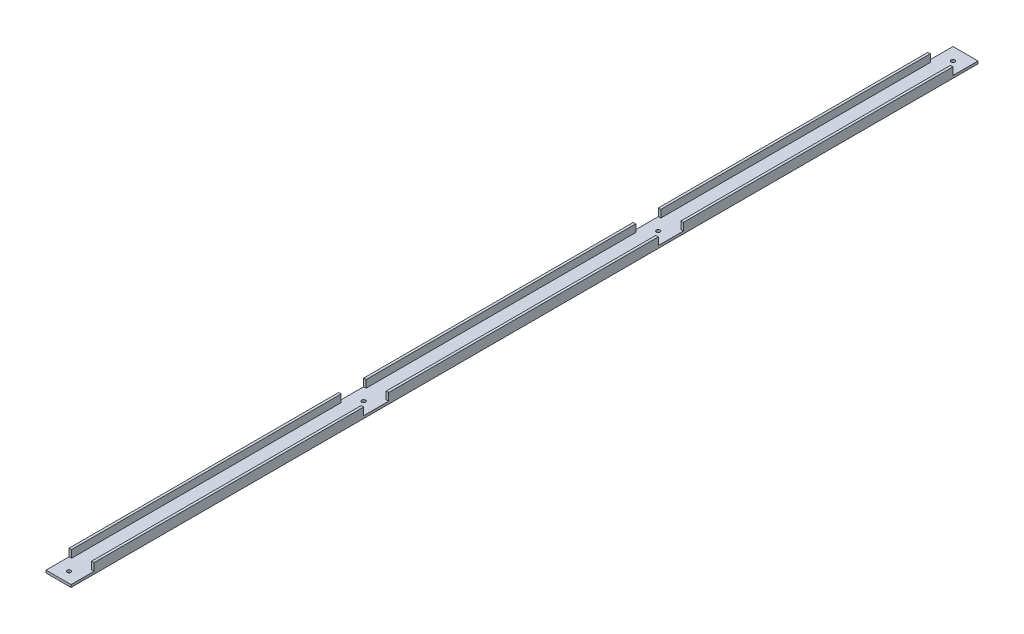
ISO-10303-21;
HEADER;
FILE_DESCRIPTION(('STEP AP214'),'2;1');
FILE_NAME('part.step','',(''),(''),'','','');
FILE_SCHEMA(('AUTOMOTIVE_DESIGN { 1 0 10303 214 1 1 1 1 }'));
ENDSEC;
DATA;
#1=APPLICATION_CONTEXT('core data for automotive mechanical design processes');
#2=APPLICATION_PROTOCOL_DEFINITION('international standard','automotive_design',2000,#1);
#3=PRODUCT_CONTEXT('',#1,'mechanical');
#4=PRODUCT('Part','Part','',(#3));
#5=PRODUCT_RELATED_PRODUCT_CATEGORY('part','',(#4));
#6=PRODUCT_DEFINITION_FORMATION('','',#4);
#7=PRODUCT_DEFINITION_CONTEXT('part definition',#1,'design');
#8=PRODUCT_DEFINITION('design','',#6,#7);
#9=PRODUCT_DEFINITION_SHAPE('','',#8);
#10=(LENGTH_UNIT() NAMED_UNIT(*) SI_UNIT(.MILLI.,.METRE.));
#11=(NAMED_UNIT(*) PLANE_ANGLE_UNIT() SI_UNIT($,.RADIAN.));
#12=(NAMED_UNIT(*) SI_UNIT($,.STERADIAN.) SOLID_ANGLE_UNIT());
#13=UNCERTAINTY_MEASURE_WITH_UNIT(LENGTH_MEASURE(1.E-05),#10,'distance_accuracy_value','');
#14=(GEOMETRIC_REPRESENTATION_CONTEXT(3) GLOBAL_UNCERTAINTY_ASSIGNED_CONTEXT((#13)) GLOBAL_UNIT_ASSIGNED_CONTEXT((#10,
#11,#12)) REPRESENTATION_CONTEXT('',''));
#15=CARTESIAN_POINT('',(0.,0.,0.));
#16=DIRECTION('',(0.,0.,1.));
#17=DIRECTION('',(1.,0.,0.));
#18=AXIS2_PLACEMENT_3D('',#15,#16,#17);
#19=CARTESIAN_POINT('',(31.75,12.7,1149.35));
#20=DIRECTION('',(0.,-1.,0.));
#21=DIRECTION('',(0.,0.,-1.));
#22=AXIS2_PLACEMENT_3D('',#19,#20,#21);
#23=PLANE('',#22);
#24=DIRECTION('',(0.,0.,-1.));
#25=VECTOR('',#24,1.);
#26=CARTESIAN_POINT('',(28.575,12.7,1149.35));
#27=LINE('',#26,#25);
#28=CARTESIAN_POINT('',(28.575,12.7,746.76));
#29=VERTEX_POINT('',#28);
#30=CARTESIAN_POINT('',(28.575,12.7,405.13));
#31=VERTEX_POINT('',#30);
#32=EDGE_CURVE('E485',#29,#31,#27,.T.);
#33=ORIENTED_EDGE('',*,*,#32,.F.);
#34=DIRECTION('',(1.,0.,0.));
#35=VECTOR('',#34,1.);
#36=CARTESIAN_POINT('',(31.75,12.7,746.76));
#37=LINE('',#36,#35);
#38=CARTESIAN_POINT('',(31.75,12.7,746.76));
#39=VERTEX_POINT('',#38);
#40=EDGE_CURVE('E345',#29,#39,#37,.T.);
#41=ORIENTED_EDGE('',*,*,#40,.T.);
#42=DIRECTION('',(0.,0.,-1.));
#43=VECTOR('',#42,1.);
#44=CARTESIAN_POINT('',(31.75,12.7,1149.35));
#45=LINE('',#44,#43);
#46=CARTESIAN_POINT('',(31.75,12.7,405.13));
#47=VERTEX_POINT('',#46);
#48=EDGE_CURVE('E487',#39,#47,#45,.T.);
#49=ORIENTED_EDGE('',*,*,#48,.T.);
#50=DIRECTION('',(-1.,0.,0.));
#51=VECTOR('',#50,1.);
#52=CARTESIAN_POINT('',(31.75,12.7,405.13));
#53=LINE('',#52,#51);
#54=EDGE_CURVE('E393',#47,#31,#53,.T.);
#55=ORIENTED_EDGE('',*,*,#54,.T.);
#56=EDGE_LOOP('',(#33,#41,#49,#55));
#57=FACE_BOUND('',#56,.T.);
#58=ADVANCED_FACE('F39',(#57),#23,.F.);
#59=CARTESIAN_POINT('',(28.575,3.175,1149.35));
#60=DIRECTION('',(1.,0.,0.));
#61=DIRECTION('',(0.,0.,-1.));
#62=AXIS2_PLACEMENT_3D('',#59,#60,#61);
#63=PLANE('',#62);
#64=DIRECTION('',(0.,0.,-1.));
#65=VECTOR('',#64,1.);
#66=CARTESIAN_POINT('',(28.575,3.175,1149.35));
#67=LINE('',#66,#65);
#68=CARTESIAN_POINT('',(28.575,3.175,746.76));
#69=VERTEX_POINT('',#68);
#70=CARTESIAN_POINT('',(28.575,3.17499999999978,405.13));
#71=VERTEX_POINT('',#70);
#72=EDGE_CURVE('E480',#69,#71,#67,.T.);
#73=ORIENTED_EDGE('',*,*,#72,.F.);
#74=DIRECTION('',(0.,1.,0.));
#75=VECTOR('',#74,1.);
#76=CARTESIAN_POINT('',(28.575,3.175,746.76));
#77=LINE('',#76,#75);
#78=EDGE_CURVE('E342',#69,#29,#77,.T.);
#79=ORIENTED_EDGE('',*,*,#78,.T.);
#80=ORIENTED_EDGE('',*,*,#32,.T.);
#81=DIRECTION('',(0.,-1.,0.));
#82=VECTOR('',#81,1.);
#83=CARTESIAN_POINT('',(28.575,3.175,405.13));
#84=LINE('',#83,#82);
#85=EDGE_CURVE('E389',#31,#71,#84,.T.);
#86=ORIENTED_EDGE('',*,*,#85,.T.);
#87=EDGE_LOOP('',(#73,#79,#80,#86));
#88=FACE_BOUND('',#87,.T.);
#89=ADVANCED_FACE('F525',(#88),#63,.F.);
#90=CARTESIAN_POINT('',(3.175,3.175,1149.35));
#91=DIRECTION('',(-1.,0.,0.));
#92=DIRECTION('',(0.,0.,1.));
#93=AXIS2_PLACEMENT_3D('',#90,#91,#92);
#94=PLANE('',#93);
#95=DIRECTION('',(0.,0.,-1.));
#96=VECTOR('',#95,1.);
#97=CARTESIAN_POINT('',(3.175,12.7,1149.35));
#98=LINE('',#97,#96);
#99=CARTESIAN_POINT('',(3.175,12.7,746.76));
#100=VERTEX_POINT('',#99);
#101=CARTESIAN_POINT('',(3.175,12.7,405.13));
#102=VERTEX_POINT('',#101);
#103=EDGE_CURVE('E470',#100,#102,#98,.T.);
#104=ORIENTED_EDGE('',*,*,#103,.F.);
#105=DIRECTION('',(0.,-1.,0.));
#106=VECTOR('',#105,1.);
#107=CARTESIAN_POINT('',(3.175,3.175,746.76));
#108=LINE('',#107,#106);
#109=CARTESIAN_POINT('',(3.175,3.17499999999951,746.76));
#110=VERTEX_POINT('',#109);
#111=EDGE_CURVE('E339',#100,#110,#108,.T.);
#112=ORIENTED_EDGE('',*,*,#111,.T.);
#113=DIRECTION('',(0.,0.,-1.));
#114=VECTOR('',#113,1.);
#115=CARTESIAN_POINT('',(3.175,3.175,1149.35));
#116=LINE('',#115,#114);
#117=CARTESIAN_POINT('',(3.175,3.17499999999978,405.13));
#118=VERTEX_POINT('',#117);
#119=EDGE_CURVE('E475',#110,#118,#116,.T.);
#120=ORIENTED_EDGE('',*,*,#119,.T.);
#121=DIRECTION('',(0.,1.,0.));
#122=VECTOR('',#121,1.);
#123=CARTESIAN_POINT('',(3.175,3.175,405.13));
#124=LINE('',#123,#122);
#125=EDGE_CURVE('E385',#118,#102,#124,.T.);
#126=ORIENTED_EDGE('',*,*,#125,.T.);
#127=EDGE_LOOP('',(#104,#112,#120,#126));
#128=FACE_BOUND('',#127,.T.);
#129=ADVANCED_FACE('F553',(#128),#94,.F.);
#130=CARTESIAN_POINT('',(0.,12.7,1149.35));
#131=DIRECTION('',(0.,-1.,0.));
#132=DIRECTION('',(0.,0.,-1.));
#133=AXIS2_PLACEMENT_3D('',#130,#131,#132);
#134=PLANE('',#133);
#135=DIRECTION('',(0.,0.,-1.));
#136=VECTOR('',#135,1.);
#137=CARTESIAN_POINT('',(0.,12.7,1149.35));
#138=LINE('',#137,#136);
#139=CARTESIAN_POINT('',(0.,12.7,746.76));
#140=VERTEX_POINT('',#139);
#141=CARTESIAN_POINT('',(0.,12.7,405.13));
#142=VERTEX_POINT('',#141);
#143=EDGE_CURVE('E465',#140,#142,#138,.T.);
#144=ORIENTED_EDGE('',*,*,#143,.F.);
#145=DIRECTION('',(1.,0.,0.));
#146=VECTOR('',#145,1.);
#147=CARTESIAN_POINT('',(0.,12.7,746.76));
#148=LINE('',#147,#146);
#149=EDGE_CURVE('E336',#140,#100,#148,.T.);
#150=ORIENTED_EDGE('',*,*,#149,.T.);
#151=ORIENTED_EDGE('',*,*,#103,.T.);
#152=DIRECTION('',(-1.,0.,0.));
#153=VECTOR('',#152,1.);
#154=CARTESIAN_POINT('',(0.,12.7,405.13));
#155=LINE('',#154,#153);
#156=EDGE_CURVE('E377',#102,#142,#155,.T.);
#157=ORIENTED_EDGE('',*,*,#156,.T.);
#158=EDGE_LOOP('',(#144,#150,#151,#157));
#159=FACE_BOUND('',#158,.T.);
#160=ADVANCED_FACE('F558',(#159),#134,.F.);
#161=CARTESIAN_POINT('',(28.575,12.7,373.38));
#162=VERTEX_POINT('',#161);
#163=CARTESIAN_POINT('',(28.575,12.7,31.75));
#164=VERTEX_POINT('',#163);
#165=EDGE_CURVE('E479',#162,#164,#27,.T.);
#166=ORIENTED_EDGE('',*,*,#165,.F.);
#167=DIRECTION('',(1.,0.,0.));
#168=VECTOR('',#167,1.);
#169=CARTESIAN_POINT('',(31.75,12.7,373.38));
#170=LINE('',#169,#168);
#171=CARTESIAN_POINT('',(31.75,12.7,373.38));
#172=VERTEX_POINT('',#171);
#173=EDGE_CURVE('E409',#162,#172,#170,.T.);
#174=ORIENTED_EDGE('',*,*,#173,.T.);
#175=CARTESIAN_POINT('',(31.75,12.7,31.75));
#176=VERTEX_POINT('',#175);
#177=EDGE_CURVE('E484',#172,#176,#45,.T.);
#178=ORIENTED_EDGE('',*,*,#177,.T.);
#179=DIRECTION('',(-1.,0.,0.));
#180=VECTOR('',#179,1.);
#181=CARTESIAN_POINT('',(-61.2758291832165,12.7,31.75));
#182=LINE('',#181,#180);
#183=EDGE_CURVE('E431',#176,#164,#182,.T.);
#184=ORIENTED_EDGE('',*,*,#183,.T.);
#185=EDGE_LOOP('',(#166,#174,#178,#184));
#186=FACE_BOUND('',#185,.T.);
#187=ADVANCED_FACE('F509',(#186),#23,.F.);
#188=CARTESIAN_POINT('',(28.575,3.175,373.38));
#189=VERTEX_POINT('',#188);
#190=CARTESIAN_POINT('',(28.575,3.175,31.75));
#191=VERTEX_POINT('',#190);
#192=EDGE_CURVE('E474',#189,#191,#67,.T.);
#193=ORIENTED_EDGE('',*,*,#192,.F.);
#194=DIRECTION('',(0.,1.,0.));
#195=VECTOR('',#194,1.);
#196=CARTESIAN_POINT('',(28.575,3.175,373.38));
#197=LINE('',#196,#195);
#198=EDGE_CURVE('E405',#189,#162,#197,.T.);
#199=ORIENTED_EDGE('',*,*,#198,.T.);
#200=ORIENTED_EDGE('',*,*,#165,.T.);
#201=DIRECTION('',(0.,-1.,0.));
#202=VECTOR('',#201,1.);
#203=CARTESIAN_POINT('',(28.575,12.701,31.75));
#204=LINE('',#203,#202);
#205=EDGE_CURVE('E434',#164,#191,#204,.T.);
#206=ORIENTED_EDGE('',*,*,#205,.T.);
#207=EDGE_LOOP('',(#193,#199,#200,#206));
#208=FACE_BOUND('',#207,.T.);
#209=ADVANCED_FACE('F531',(#208),#63,.F.);
#210=CARTESIAN_POINT('',(3.175,12.7,373.38));
#211=VERTEX_POINT('',#210);
#212=CARTESIAN_POINT('',(3.175,12.7,31.75));
#213=VERTEX_POINT('',#212);
#214=EDGE_CURVE('E464',#211,#213,#98,.T.);
#215=ORIENTED_EDGE('',*,*,#214,.F.);
#216=DIRECTION('',(0.,-1.,0.));
#217=VECTOR('',#216,1.);
#218=CARTESIAN_POINT('',(3.175,3.175,373.38));
#219=LINE('',#218,#217);
#220=CARTESIAN_POINT('',(3.175,3.17499999999978,373.38));
#221=VERTEX_POINT('',#220);
#222=EDGE_CURVE('E401',#211,#221,#219,.T.);
#223=ORIENTED_EDGE('',*,*,#222,.T.);
#224=CARTESIAN_POINT('',(3.175,3.175,31.75));
#225=VERTEX_POINT('',#224);
#226=EDGE_CURVE('E469',#221,#225,#116,.T.);
#227=ORIENTED_EDGE('',*,*,#226,.T.);
#228=DIRECTION('',(0.,1.,0.));
#229=VECTOR('',#228,1.);
#230=CARTESIAN_POINT('',(3.175,12.701,31.75));
#231=LINE('',#230,#229);
#232=EDGE_CURVE('E414',#225,#213,#231,.T.);
#233=ORIENTED_EDGE('',*,*,#232,.T.);
#234=EDGE_LOOP('',(#215,#223,#227,#233));
#235=FACE_BOUND('',#234,.T.);
#236=ADVANCED_FACE('F653',(#235),#94,.F.);
#237=CARTESIAN_POINT('',(0.,12.7,373.38));
#238=VERTEX_POINT('',#237);
#239=CARTESIAN_POINT('',(0.,12.7,31.75));
#240=VERTEX_POINT('',#239);
#241=EDGE_CURVE('E454',#238,#240,#138,.T.);
#242=ORIENTED_EDGE('',*,*,#241,.F.);
#243=DIRECTION('',(1.,0.,0.));
#244=VECTOR('',#243,1.);
#245=CARTESIAN_POINT('',(0.,12.7,373.38));
#246=LINE('',#245,#244);
#247=EDGE_CURVE('E397',#238,#211,#246,.T.);
#248=ORIENTED_EDGE('',*,*,#247,.T.);
#249=ORIENTED_EDGE('',*,*,#214,.T.);
#250=DIRECTION('',(-1.,0.,0.));
#251=VECTOR('',#250,1.);
#252=CARTESIAN_POINT('',(-61.2758291832165,12.7,31.75));
#253=LINE('',#252,#251);
#254=EDGE_CURVE('E427',#213,#240,#253,.T.);
#255=ORIENTED_EDGE('',*,*,#254,.T.);
#256=EDGE_LOOP('',(#242,#248,#249,#255));
#257=FACE_BOUND('',#256,.T.);
#258=ADVANCED_FACE('F674',(#257),#134,.F.);
#259=CARTESIAN_POINT('',(0.,0.,1149.35));
#260=DIRECTION('',(1.,0.,0.));
#261=DIRECTION('',(0.,0.,-1.));
#262=AXIS2_PLACEMENT_3D('',#259,#260,#261);
#263=PLANE('',#262);
#264=DIRECTION('',(0.,0.,1.));
#265=VECTOR('',#264,1.);
#266=CARTESIAN_POINT('',(0.,3.17499999999925,1120.14));
#267=LINE('',#266,#265);
#268=CARTESIAN_POINT('',(0.,3.17499999999925,1120.14));
#269=VERTEX_POINT('',#268);
#270=CARTESIAN_POINT('',(0.,3.17499999999925,1149.35));
#271=VERTEX_POINT('',#270);
#272=EDGE_CURVE('E275',#269,#271,#267,.T.);
#273=ORIENTED_EDGE('',*,*,#272,.F.);
#274=DIRECTION('',(0.,-1.,0.));
#275=VECTOR('',#274,1.);
#276=CARTESIAN_POINT('',(0.,15.8749999999992,1120.14));
#277=LINE('',#276,#275);
#278=CARTESIAN_POINT('',(0.,12.7,1120.14));
#279=VERTEX_POINT('',#278);
#280=EDGE_CURVE('E280',#279,#269,#277,.T.);
#281=ORIENTED_EDGE('',*,*,#280,.F.);
#282=CARTESIAN_POINT('',(0.,12.7,778.51));
#283=VERTEX_POINT('',#282);
#284=EDGE_CURVE('E66',#279,#283,#138,.T.);
#285=ORIENTED_EDGE('',*,*,#284,.T.);
#286=DIRECTION('',(0.,1.,0.));
#287=VECTOR('',#286,1.);
#288=CARTESIAN_POINT('',(0.,3.17499999999951,778.51));
#289=LINE('',#288,#287);
#290=CARTESIAN_POINT('',(0.,3.17499999999951,778.51));
#291=VERTEX_POINT('',#290);
#292=EDGE_CURVE('E306',#291,#283,#289,.T.);
#293=ORIENTED_EDGE('',*,*,#292,.F.);
#294=DIRECTION('',(0.,0.,1.));
#295=VECTOR('',#294,1.);
#296=CARTESIAN_POINT('',(0.,3.17499999999951,746.76));
#297=LINE('',#296,#295);
#298=CARTESIAN_POINT('',(0.,3.17499999999951,746.76));
#299=VERTEX_POINT('',#298);
#300=EDGE_CURVE('E314',#299,#291,#297,.T.);
#301=ORIENTED_EDGE('',*,*,#300,.F.);
#302=DIRECTION('',(0.,-1.,0.));
#303=VECTOR('',#302,1.);
#304=CARTESIAN_POINT('',(0.,15.8749999999995,746.76));
#305=LINE('',#304,#303);
#306=EDGE_CURVE('E301',#140,#299,#305,.T.);
#307=ORIENTED_EDGE('',*,*,#306,.F.);
#308=ORIENTED_EDGE('',*,*,#143,.T.);
#309=DIRECTION('',(0.,1.,0.));
#310=VECTOR('',#309,1.);
#311=CARTESIAN_POINT('',(0.,3.17499999999978,405.13));
#312=LINE('',#311,#310);
#313=CARTESIAN_POINT('',(0.,3.17499999999978,405.13));
#314=VERTEX_POINT('',#313);
#315=EDGE_CURVE('E354',#314,#142,#312,.T.);
#316=ORIENTED_EDGE('',*,*,#315,.F.);
#317=DIRECTION('',(0.,0.,1.));
#318=VECTOR('',#317,1.);
#319=CARTESIAN_POINT('',(0.,3.17499999999978,373.38));
#320=LINE('',#319,#318);
#321=CARTESIAN_POINT('',(0.,3.17499999999978,373.38));
#322=VERTEX_POINT('',#321);
#323=EDGE_CURVE('E366',#322,#314,#320,.T.);
#324=ORIENTED_EDGE('',*,*,#323,.F.);
#325=DIRECTION('',(0.,-1.,0.));
#326=VECTOR('',#325,1.);
#327=CARTESIAN_POINT('',(0.,15.8749999999998,373.38));
#328=LINE('',#327,#326);
#329=EDGE_CURVE('E348',#238,#322,#328,.T.);
#330=ORIENTED_EDGE('',*,*,#329,.F.);
#331=ORIENTED_EDGE('',*,*,#241,.T.);
#332=DIRECTION('',(0.,-1.,0.));
#333=VECTOR('',#332,1.);
#334=CARTESIAN_POINT('',(0.,12.701,31.75));
#335=LINE('',#334,#333);
#336=CARTESIAN_POINT('',(0.,3.175,31.75));
#337=VERTEX_POINT('',#336);
#338=EDGE_CURVE('E417',#240,#337,#335,.T.);
#339=ORIENTED_EDGE('',*,*,#338,.T.);
#340=DIRECTION('',(0.,0.,-1.));
#341=VECTOR('',#340,1.);
#342=CARTESIAN_POINT('',(0.,3.175,0.));
#343=LINE('',#342,#341);
#344=CARTESIAN_POINT('',(0.,3.175,0.));
#345=VERTEX_POINT('',#344);
#346=EDGE_CURVE('E424',#337,#345,#343,.T.);
#347=ORIENTED_EDGE('',*,*,#346,.T.);
#348=DIRECTION('',(0.,-1.,0.));
#349=VECTOR('',#348,1.);
#350=CARTESIAN_POINT('',(0.,0.,0.));
#351=LINE('',#350,#349);
#352=CARTESIAN_POINT('',(0.,0.,0.));
#353=VERTEX_POINT('',#352);
#354=EDGE_CURVE('E430',#345,#353,#351,.T.);
#355=ORIENTED_EDGE('',*,*,#354,.T.);
#356=DIRECTION('',(0.,0.,-1.));
#357=VECTOR('',#356,1.);
#358=CARTESIAN_POINT('',(0.,0.,1149.35));
#359=LINE('',#358,#357);
#360=CARTESIAN_POINT('',(0.,0.,1149.35));
#361=VERTEX_POINT('',#360);
#362=EDGE_CURVE('E11',#361,#353,#359,.T.);
#363=ORIENTED_EDGE('',*,*,#362,.F.);
#364=DIRECTION('',(0.,-1.,0.));
#365=VECTOR('',#364,1.);
#366=CARTESIAN_POINT('',(0.,0.,1149.35));
#367=LINE('',#366,#365);
#368=EDGE_CURVE('E443',#271,#361,#367,.T.);
#369=ORIENTED_EDGE('',*,*,#368,.F.);
#370=EDGE_LOOP('',(#273,#281,#285,#293,#301,#307,#308,#316,#324,#330,#331,#339,#347,#355,#363,#369));
#371=FACE_BOUND('',#370,.T.);
#372=ADVANCED_FACE('F41',(#371),#263,.F.);
#373=CARTESIAN_POINT('',(31.75,0.,1149.35));
#374=DIRECTION('',(-1.,0.,0.));
#375=DIRECTION('',(0.,0.,1.));
#376=AXIS2_PLACEMENT_3D('',#373,#374,#375);
#377=PLANE('',#376);
#378=CARTESIAN_POINT('',(31.75,12.7,1120.14));
#379=VERTEX_POINT('',#378);
#380=CARTESIAN_POINT('',(31.75,12.7,778.51));
#381=VERTEX_POINT('',#380);
#382=EDGE_CURVE('E273',#379,#381,#45,.T.);
#383=ORIENTED_EDGE('',*,*,#382,.F.);
#384=DIRECTION('',(0.,-1.,0.));
#385=VECTOR('',#384,1.);
#386=CARTESIAN_POINT('',(31.75,15.8749999999992,1120.14));
#387=LINE('',#386,#385);
#388=CARTESIAN_POINT('',(31.75,3.17499999999925,1120.14));
#389=VERTEX_POINT('',#388);
#390=EDGE_CURVE('E254',#379,#389,#387,.T.);
#391=ORIENTED_EDGE('',*,*,#390,.T.);
#392=DIRECTION('',(0.,0.,1.));
#393=VECTOR('',#392,1.);
#394=CARTESIAN_POINT('',(31.75,3.17499999999925,1120.14));
#395=LINE('',#394,#393);
#396=CARTESIAN_POINT('',(31.75,3.17499999999925,1149.35));
#397=VERTEX_POINT('',#396);
#398=EDGE_CURVE('E264',#389,#397,#395,.T.);
#399=ORIENTED_EDGE('',*,*,#398,.T.);
#400=DIRECTION('',(0.,1.,0.));
#401=VECTOR('',#400,1.);
#402=CARTESIAN_POINT('',(31.75,0.,1149.35));
#403=LINE('',#402,#401);
#404=CARTESIAN_POINT('',(31.75,0.,1149.35));
#405=VERTEX_POINT('',#404);
#406=EDGE_CURVE('E450',#405,#397,#403,.T.);
#407=ORIENTED_EDGE('',*,*,#406,.F.);
#408=DIRECTION('',(0.,0.,-1.));
#409=VECTOR('',#408,1.);
#410=CARTESIAN_POINT('',(31.75,0.,1149.35));
#411=LINE('',#410,#409);
#412=CARTESIAN_POINT('',(31.75,0.,0.));
#413=VERTEX_POINT('',#412);
#414=EDGE_CURVE('E48',#405,#413,#411,.T.);
#415=ORIENTED_EDGE('',*,*,#414,.T.);
#416=DIRECTION('',(0.,1.,0.));
#417=VECTOR('',#416,1.);
#418=CARTESIAN_POINT('',(31.75,0.,0.));
#419=LINE('',#418,#417);
#420=CARTESIAN_POINT('',(31.75,3.175,0.));
#421=VERTEX_POINT('',#420);
#422=EDGE_CURVE('E458',#413,#421,#419,.T.);
#423=ORIENTED_EDGE('',*,*,#422,.T.);
#424=DIRECTION('',(0.,0.,1.));
#425=VECTOR('',#424,1.);
#426=CARTESIAN_POINT('',(31.75,3.175,0.));
#427=LINE('',#426,#425);
#428=CARTESIAN_POINT('',(31.75,3.175,31.75));
#429=VERTEX_POINT('',#428);
#430=EDGE_CURVE('E418',#421,#429,#427,.T.);
#431=ORIENTED_EDGE('',*,*,#430,.T.);
#432=DIRECTION('',(0.,1.,0.));
#433=VECTOR('',#432,1.);
#434=CARTESIAN_POINT('',(31.75,12.701,31.75));
#435=LINE('',#434,#433);
#436=EDGE_CURVE('E435',#429,#176,#435,.T.);
#437=ORIENTED_EDGE('',*,*,#436,.T.);
#438=ORIENTED_EDGE('',*,*,#177,.F.);
#439=DIRECTION('',(0.,-1.,0.));
#440=VECTOR('',#439,1.);
#441=CARTESIAN_POINT('',(31.75,15.8749999999998,373.38));
#442=LINE('',#441,#440);
#443=CARTESIAN_POINT('',(31.75,3.17499999999978,373.38));
#444=VERTEX_POINT('',#443);
#445=EDGE_CURVE('E349',#172,#444,#442,.T.);
#446=ORIENTED_EDGE('',*,*,#445,.T.);
#447=DIRECTION('',(0.,0.,1.));
#448=VECTOR('',#447,1.);
#449=CARTESIAN_POINT('',(31.75,3.17499999999978,373.38));
#450=LINE('',#449,#448);
#451=CARTESIAN_POINT('',(31.75,3.17499999999978,405.13));
#452=VERTEX_POINT('',#451);
#453=EDGE_CURVE('E353',#444,#452,#450,.T.);
#454=ORIENTED_EDGE('',*,*,#453,.T.);
#455=DIRECTION('',(0.,1.,0.));
#456=VECTOR('',#455,1.);
#457=CARTESIAN_POINT('',(31.75,3.17499999999978,405.13));
#458=LINE('',#457,#456);
#459=EDGE_CURVE('E358',#452,#47,#458,.T.);
#460=ORIENTED_EDGE('',*,*,#459,.T.);
#461=ORIENTED_EDGE('',*,*,#48,.F.);
#462=DIRECTION('',(0.,-1.,0.));
#463=VECTOR('',#462,1.);
#464=CARTESIAN_POINT('',(31.75,15.8749999999995,746.76));
#465=LINE('',#464,#463);
#466=CARTESIAN_POINT('',(31.75,3.17499999999951,746.76));
#467=VERTEX_POINT('',#466);
#468=EDGE_CURVE('E302',#39,#467,#465,.T.);
#469=ORIENTED_EDGE('',*,*,#468,.T.);
#470=DIRECTION('',(0.,0.,1.));
#471=VECTOR('',#470,1.);
#472=CARTESIAN_POINT('',(31.75,3.17499999999951,746.76));
#473=LINE('',#472,#471);
#474=CARTESIAN_POINT('',(31.75,3.17499999999951,778.51));
#475=VERTEX_POINT('',#474);
#476=EDGE_CURVE('E305',#467,#475,#473,.T.);
#477=ORIENTED_EDGE('',*,*,#476,.T.);
#478=DIRECTION('',(0.,1.,0.));
#479=VECTOR('',#478,1.);
#480=CARTESIAN_POINT('',(31.75,3.17499999999951,778.51));
#481=LINE('',#480,#479);
#482=EDGE_CURVE('E309',#475,#381,#481,.T.);
#483=ORIENTED_EDGE('',*,*,#482,.T.);
#484=EDGE_LOOP('',(#383,#391,#399,#407,#415,#423,#431,#437,#438,#446,#454,#460,#461,#469,#477,#483));
#485=FACE_BOUND('',#484,.T.);
#486=ADVANCED_FACE('F271',(#485),#377,.F.);
#487=CARTESIAN_POINT('',(28.575,12.7,1120.14));
#488=VERTEX_POINT('',#487);
#489=CARTESIAN_POINT('',(28.575,12.7,778.51));
#490=VERTEX_POINT('',#489);
#491=EDGE_CURVE('E481',#488,#490,#27,.T.);
#492=ORIENTED_EDGE('',*,*,#491,.F.);
#493=DIRECTION('',(1.,0.,0.));
#494=VECTOR('',#493,1.);
#495=CARTESIAN_POINT('',(31.75,12.7,1120.14));
#496=LINE('',#495,#494);
#497=EDGE_CURVE('E298',#488,#379,#496,.T.);
#498=ORIENTED_EDGE('',*,*,#497,.T.);
#499=ORIENTED_EDGE('',*,*,#382,.T.);
#500=DIRECTION('',(-1.,0.,0.));
#501=VECTOR('',#500,1.);
#502=CARTESIAN_POINT('',(31.75,12.7,778.51));
#503=LINE('',#502,#501);
#504=EDGE_CURVE('E333',#381,#490,#503,.T.);
#505=ORIENTED_EDGE('',*,*,#504,.T.);
#506=EDGE_LOOP('',(#492,#498,#499,#505));
#507=FACE_BOUND('',#506,.T.);
#508=ADVANCED_FACE('F548',(#507),#23,.F.);
#509=CARTESIAN_POINT('',(28.575,3.17499999999925,1120.14));
#510=VERTEX_POINT('',#509);
#511=CARTESIAN_POINT('',(28.575,3.17499999999951,778.51));
#512=VERTEX_POINT('',#511);
#513=EDGE_CURVE('E476',#510,#512,#67,.T.);
#514=ORIENTED_EDGE('',*,*,#513,.F.);
#515=DIRECTION('',(0.,1.,0.));
#516=VECTOR('',#515,1.);
#517=CARTESIAN_POINT('',(28.575,3.175,1120.14));
#518=LINE('',#517,#516);
#519=EDGE_CURVE('E257',#510,#488,#518,.T.);
#520=ORIENTED_EDGE('',*,*,#519,.T.);
#521=ORIENTED_EDGE('',*,*,#491,.T.);
#522=DIRECTION('',(0.,-1.,0.));
#523=VECTOR('',#522,1.);
#524=CARTESIAN_POINT('',(28.575,3.175,778.51));
#525=LINE('',#524,#523);
#526=EDGE_CURVE('E330',#490,#512,#525,.T.);
#527=ORIENTED_EDGE('',*,*,#526,.T.);
#528=EDGE_LOOP('',(#514,#520,#521,#527));
#529=FACE_BOUND('',#528,.T.);
#530=ADVANCED_FACE('F555',(#529),#63,.F.);
#531=CARTESIAN_POINT('',(3.175,12.7,1120.14));
#532=VERTEX_POINT('',#531);
#533=CARTESIAN_POINT('',(3.175,12.7,778.51));
#534=VERTEX_POINT('',#533);
#535=EDGE_CURVE('E466',#532,#534,#98,.T.);
#536=ORIENTED_EDGE('',*,*,#535,.F.);
#537=DIRECTION('',(0.,-1.,0.));
#538=VECTOR('',#537,1.);
#539=CARTESIAN_POINT('',(3.175,3.175,1120.14));
#540=LINE('',#539,#538);
#541=CARTESIAN_POINT('',(3.175,3.17499999999925,1120.14));
#542=VERTEX_POINT('',#541);
#543=EDGE_CURVE('E293',#532,#542,#540,.T.);
#544=ORIENTED_EDGE('',*,*,#543,.T.);
#545=CARTESIAN_POINT('',(3.175,3.17499999999951,778.51));
#546=VERTEX_POINT('',#545);
#547=EDGE_CURVE('E471',#542,#546,#116,.T.);
#548=ORIENTED_EDGE('',*,*,#547,.T.);
#549=DIRECTION('',(0.,1.,0.));
#550=VECTOR('',#549,1.);
#551=CARTESIAN_POINT('',(3.175,3.175,778.51));
#552=LINE('',#551,#550);
#553=EDGE_CURVE('E327',#546,#534,#552,.T.);
#554=ORIENTED_EDGE('',*,*,#553,.T.);
#555=EDGE_LOOP('',(#536,#544,#548,#554));
#556=FACE_BOUND('',#555,.T.);
#557=ADVANCED_FACE('F566',(#556),#94,.F.);
#558=ORIENTED_EDGE('',*,*,#284,.F.);
#559=DIRECTION('',(1.,0.,0.));
#560=VECTOR('',#559,1.);
#561=CARTESIAN_POINT('',(0.,12.7,1120.14));
#562=LINE('',#561,#560);
#563=EDGE_CURVE('E260',#279,#532,#562,.T.);
#564=ORIENTED_EDGE('',*,*,#563,.T.);
#565=ORIENTED_EDGE('',*,*,#535,.T.);
#566=DIRECTION('',(-1.,0.,0.));
#567=VECTOR('',#566,1.);
#568=CARTESIAN_POINT('',(0.,12.7,778.51));
#569=LINE('',#568,#567);
#570=EDGE_CURVE('E321',#534,#283,#569,.T.);
#571=ORIENTED_EDGE('',*,*,#570,.T.);
#572=EDGE_LOOP('',(#558,#564,#565,#571));
#573=FACE_BOUND('',#572,.T.);
#574=ADVANCED_FACE('F688',(#573),#134,.F.);
#575=CARTESIAN_POINT('',(0.,0.,0.));
#576=DIRECTION('',(0.,0.,-1.));
#577=DIRECTION('',(-1.,0.,0.));
#578=AXIS2_PLACEMENT_3D('',#575,#576,#577);
#579=PLANE('',#578);
#580=ORIENTED_EDGE('',*,*,#354,.F.);
#581=DIRECTION('',(-1.,0.,0.));
#582=VECTOR('',#581,1.);
#583=CARTESIAN_POINT('',(3.175,3.175,0.));
#584=LINE('',#583,#582);
#585=EDGE_CURVE('E447',#421,#345,#584,.T.);
#586=ORIENTED_EDGE('',*,*,#585,.F.);
#587=ORIENTED_EDGE('',*,*,#422,.F.);
#588=DIRECTION('',(1.,0.,0.));
#589=VECTOR('',#588,1.);
#590=CARTESIAN_POINT('',(0.,0.,0.));
#591=LINE('',#590,#589);
#592=EDGE_CURVE('E456',#353,#413,#591,.T.);
#593=ORIENTED_EDGE('',*,*,#592,.F.);
#594=EDGE_LOOP('',(#580,#586,#587,#593));
#595=FACE_BOUND('',#594,.T.);
#596=ADVANCED_FACE('F497',(#595),#579,.T.);
#597=CARTESIAN_POINT('',(0.,0.,1149.35));
#598=DIRECTION('',(0.,1.,0.));
#599=DIRECTION('',(0.,0.,1.));
#600=AXIS2_PLACEMENT_3D('',#597,#598,#599);
#601=PLANE('',#600);
#602=CARTESIAN_POINT('',(15.875,0.,15.875));
#603=DIRECTION('',(0.,1.,0.));
#604=DIRECTION('',(0.,0.,1.));
#605=AXIS2_PLACEMENT_3D('',#602,#603,#604);
#606=CIRCLE('',#605,2.413);
#607=CARTESIAN_POINT('',(15.875,0.,18.288));
#608=VERTEX_POINT('',#607);
#609=EDGE_CURVE('E288',#608,#608,#606,.F.);
#610=ORIENTED_EDGE('',*,*,#609,.F.);
#611=EDGE_LOOP('',(#610));
#612=FACE_BOUND('',#611,.T.);
#613=CARTESIAN_POINT('',(15.875,0.,389.255));
#614=DIRECTION('',(0.,1.,0.));
#615=DIRECTION('',(0.,0.,1.));
#616=AXIS2_PLACEMENT_3D('',#613,#614,#615);
#617=CIRCLE('',#616,2.413);
#618=CARTESIAN_POINT('',(15.875,0.,391.668));
#619=VERTEX_POINT('',#618);
#620=EDGE_CURVE('E616',#619,#619,#617,.F.);
#621=ORIENTED_EDGE('',*,*,#620,.F.);
#622=EDGE_LOOP('',(#621));
#623=FACE_BOUND('',#622,.T.);
#624=CARTESIAN_POINT('',(15.875,0.,762.635));
#625=DIRECTION('',(0.,1.,0.));
#626=DIRECTION('',(0.,0.,1.));
#627=AXIS2_PLACEMENT_3D('',#624,#625,#626);
#628=CIRCLE('',#627,2.413);
#629=CARTESIAN_POINT('',(15.875,0.,765.048));
#630=VERTEX_POINT('',#629);
#631=EDGE_CURVE('E623',#630,#630,#628,.F.);
#632=ORIENTED_EDGE('',*,*,#631,.F.);
#633=EDGE_LOOP('',(#632));
#634=FACE_BOUND('',#633,.T.);
#635=CARTESIAN_POINT('',(15.875,0.,1136.015));
#636=DIRECTION('',(0.,1.,0.));
#637=DIRECTION('',(0.,0.,1.));
#638=AXIS2_PLACEMENT_3D('',#635,#636,#637);
#639=CIRCLE('',#638,2.413);
#640=CARTESIAN_POINT('',(15.875,0.,1138.428));
#641=VERTEX_POINT('',#640);
#642=EDGE_CURVE('E283',#641,#641,#639,.F.);
#643=ORIENTED_EDGE('',*,*,#642,.F.);
#644=EDGE_LOOP('',(#643));
#645=FACE_BOUND('',#644,.T.);
#646=ORIENTED_EDGE('',*,*,#592,.T.);
#647=ORIENTED_EDGE('',*,*,#414,.F.);
#648=DIRECTION('',(1.,0.,0.));
#649=VECTOR('',#648,1.);
#650=CARTESIAN_POINT('',(0.,0.,1149.35));
#651=LINE('',#650,#649);
#652=EDGE_CURVE('E446',#361,#405,#651,.T.);
#653=ORIENTED_EDGE('',*,*,#652,.F.);
#654=ORIENTED_EDGE('',*,*,#362,.T.);
#655=EDGE_LOOP('',(#646,#647,#653,#654));
#656=FACE_BOUND('',#655,.T.);
#657=ADVANCED_FACE('F640',(#612,#623,#634,#645,#656),#601,.F.);
#658=CARTESIAN_POINT('',(3.175,3.175,1149.35));
#659=DIRECTION('',(0.,-1.,0.));
#660=DIRECTION('',(0.,0.,-1.));
#661=AXIS2_PLACEMENT_3D('',#658,#659,#660);
#662=PLANE('',#661);
#663=CARTESIAN_POINT('',(15.875,3.175,15.875));
#664=DIRECTION('',(0.,1.,0.));
#665=DIRECTION('',(0.,0.,1.));
#666=AXIS2_PLACEMENT_3D('',#663,#664,#665);
#667=CIRCLE('',#666,2.413);
#668=CARTESIAN_POINT('',(15.875,3.175,18.288));
#669=VERTEX_POINT('',#668);
#670=EDGE_CURVE('E611',#669,#669,#667,.T.);
#671=ORIENTED_EDGE('',*,*,#670,.F.);
#672=EDGE_LOOP('',(#671));
#673=FACE_BOUND('',#672,.T.);
#674=CARTESIAN_POINT('',(15.875,3.175,389.255));
#675=DIRECTION('',(0.,1.,0.));
#676=DIRECTION('',(0.,0.,1.));
#677=AXIS2_PLACEMENT_3D('',#674,#675,#676);
#678=CIRCLE('',#677,2.413);
#679=CARTESIAN_POINT('',(15.875,3.175,391.668));
#680=VERTEX_POINT('',#679);
#681=EDGE_CURVE('E619',#680,#680,#678,.T.);
#682=ORIENTED_EDGE('',*,*,#681,.F.);
#683=EDGE_LOOP('',(#682));
#684=FACE_BOUND('',#683,.T.);
#685=CARTESIAN_POINT('',(15.875,3.175,762.635));
#686=DIRECTION('',(0.,1.,0.));
#687=DIRECTION('',(0.,0.,1.));
#688=AXIS2_PLACEMENT_3D('',#685,#686,#687);
#689=CIRCLE('',#688,2.413);
#690=CARTESIAN_POINT('',(15.875,3.175,765.048));
#691=VERTEX_POINT('',#690);
#692=EDGE_CURVE('E626',#691,#691,#689,.T.);
#693=ORIENTED_EDGE('',*,*,#692,.F.);
#694=EDGE_LOOP('',(#693));
#695=FACE_BOUND('',#694,.T.);
#696=CARTESIAN_POINT('',(15.875,3.175,1136.015));
#697=DIRECTION('',(0.,1.,0.));
#698=DIRECTION('',(0.,0.,1.));
#699=AXIS2_PLACEMENT_3D('',#696,#697,#698);
#700=CIRCLE('',#699,2.413);
#701=CARTESIAN_POINT('',(15.875,3.175,1138.428));
#702=VERTEX_POINT('',#701);
#703=EDGE_CURVE('E630',#702,#702,#700,.T.);
#704=ORIENTED_EDGE('',*,*,#703,.F.);
#705=EDGE_LOOP('',(#704));
#706=FACE_BOUND('',#705,.T.);
#707=ORIENTED_EDGE('',*,*,#547,.F.);
#708=DIRECTION('',(-1.,0.,0.));
#709=VECTOR('',#708,1.);
#710=CARTESIAN_POINT('',(31.75,3.17499999999925,1120.14));
#711=LINE('',#710,#709);
#712=EDGE_CURVE('E261',#542,#269,#711,.T.);
#713=ORIENTED_EDGE('',*,*,#712,.T.);
#714=ORIENTED_EDGE('',*,*,#272,.T.);
#715=DIRECTION('',(-1.,0.,0.));
#716=VECTOR('',#715,1.);
#717=CARTESIAN_POINT('',(3.175,3.175,1149.35));
#718=LINE('',#717,#716);
#719=EDGE_CURVE('E58',#397,#271,#718,.T.);
#720=ORIENTED_EDGE('',*,*,#719,.F.);
#721=ORIENTED_EDGE('',*,*,#398,.F.);
#722=EDGE_CURVE('E250',#389,#510,#711,.T.);
#723=ORIENTED_EDGE('',*,*,#722,.T.);
#724=ORIENTED_EDGE('',*,*,#513,.T.);
#725=DIRECTION('',(-1.,0.,0.));
#726=VECTOR('',#725,1.);
#727=CARTESIAN_POINT('',(31.75,3.17499999999951,778.51));
#728=LINE('',#727,#726);
#729=EDGE_CURVE('E318',#475,#512,#728,.T.);
#730=ORIENTED_EDGE('',*,*,#729,.F.);
#731=ORIENTED_EDGE('',*,*,#476,.F.);
#732=DIRECTION('',(-1.,0.,0.));
#733=VECTOR('',#732,1.);
#734=CARTESIAN_POINT('',(31.75,3.17499999999951,746.76));
#735=LINE('',#734,#733);
#736=EDGE_CURVE('E323',#467,#69,#735,.T.);
#737=ORIENTED_EDGE('',*,*,#736,.T.);
#738=ORIENTED_EDGE('',*,*,#72,.T.);
#739=DIRECTION('',(-1.,0.,0.));
#740=VECTOR('',#739,1.);
#741=CARTESIAN_POINT('',(31.75,3.17499999999978,405.13));
#742=LINE('',#741,#740);
#743=EDGE_CURVE('E373',#452,#71,#742,.T.);
#744=ORIENTED_EDGE('',*,*,#743,.F.);
#745=ORIENTED_EDGE('',*,*,#453,.F.);
#746=DIRECTION('',(-1.,0.,0.));
#747=VECTOR('',#746,1.);
#748=CARTESIAN_POINT('',(31.75,3.17499999999978,373.38));
#749=LINE('',#748,#747);
#750=EDGE_CURVE('E379',#444,#189,#749,.T.);
#751=ORIENTED_EDGE('',*,*,#750,.T.);
#752=ORIENTED_EDGE('',*,*,#192,.T.);
#753=DIRECTION('',(1.,0.,0.));
#754=VECTOR('',#753,1.);
#755=CARTESIAN_POINT('',(-61.2758291832165,3.175,31.75));
#756=LINE('',#755,#754);
#757=EDGE_CURVE('E413',#191,#429,#756,.T.);
#758=ORIENTED_EDGE('',*,*,#757,.T.);
#759=ORIENTED_EDGE('',*,*,#430,.F.);
#760=ORIENTED_EDGE('',*,*,#585,.T.);
#761=ORIENTED_EDGE('',*,*,#346,.F.);
#762=DIRECTION('',(1.,0.,0.));
#763=VECTOR('',#762,1.);
#764=CARTESIAN_POINT('',(-61.2758291832165,3.175,31.75));
#765=LINE('',#764,#763);
#766=EDGE_CURVE('E421',#337,#225,#765,.T.);
#767=ORIENTED_EDGE('',*,*,#766,.T.);
#768=ORIENTED_EDGE('',*,*,#226,.F.);
#769=EDGE_CURVE('E362',#221,#322,#749,.T.);
#770=ORIENTED_EDGE('',*,*,#769,.T.);
#771=ORIENTED_EDGE('',*,*,#323,.T.);
#772=EDGE_CURVE('E378',#118,#314,#742,.T.);
#773=ORIENTED_EDGE('',*,*,#772,.F.);
#774=ORIENTED_EDGE('',*,*,#119,.F.);
#775=EDGE_CURVE('E311',#110,#299,#735,.T.);
#776=ORIENTED_EDGE('',*,*,#775,.T.);
#777=ORIENTED_EDGE('',*,*,#300,.T.);
#778=EDGE_CURVE('E322',#546,#291,#728,.T.);
#779=ORIENTED_EDGE('',*,*,#778,.F.);
#780=EDGE_LOOP('',(#707,#713,#714,#720,#721,#723,#724,#730,#731,#737,#738,#744,#745,#751,#752,
#758,#759,#760,#761,#767,#768,#770,#771,#773,#774,#776,#777,#779));
#781=FACE_BOUND('',#780,.T.);
#782=ADVANCED_FACE('F266',(#673,#684,#695,#706,#781),#662,.F.);
#783=CARTESIAN_POINT('',(0.,0.,1149.35));
#784=DIRECTION('',(0.,0.,-1.));
#785=DIRECTION('',(-1.,0.,0.));
#786=AXIS2_PLACEMENT_3D('',#783,#784,#785);
#787=PLANE('',#786);
#788=ORIENTED_EDGE('',*,*,#406,.T.);
#789=ORIENTED_EDGE('',*,*,#719,.T.);
#790=ORIENTED_EDGE('',*,*,#368,.T.);
#791=ORIENTED_EDGE('',*,*,#652,.T.);
#792=EDGE_LOOP('',(#788,#789,#790,#791));
#793=FACE_BOUND('',#792,.T.);
#794=ADVANCED_FACE('F728',(#793),#787,.F.);
#795=CARTESIAN_POINT('',(-61.2758291832165,12.701,31.75));
#796=DIRECTION('',(0.,0.,-1.));
#797=DIRECTION('',(-1.,0.,0.));
#798=AXIS2_PLACEMENT_3D('',#795,#796,#797);
#799=PLANE('',#798);
#800=ORIENTED_EDGE('',*,*,#757,.F.);
#801=ORIENTED_EDGE('',*,*,#205,.F.);
#802=ORIENTED_EDGE('',*,*,#183,.F.);
#803=ORIENTED_EDGE('',*,*,#436,.F.);
#804=EDGE_LOOP('',(#800,#801,#802,#803));
#805=FACE_BOUND('',#804,.T.);
#806=ADVANCED_FACE('F505',(#805),#799,.T.);
#807=CARTESIAN_POINT('',(-61.2758291832165,12.701,31.75));
#808=DIRECTION('',(0.,0.,-1.));
#809=DIRECTION('',(-1.,0.,0.));
#810=AXIS2_PLACEMENT_3D('',#807,#808,#809);
#811=PLANE('',#810);
#812=ORIENTED_EDGE('',*,*,#254,.F.);
#813=ORIENTED_EDGE('',*,*,#232,.F.);
#814=ORIENTED_EDGE('',*,*,#766,.F.);
#815=ORIENTED_EDGE('',*,*,#338,.F.);
#816=EDGE_LOOP('',(#812,#813,#814,#815));
#817=FACE_BOUND('',#816,.T.);
#818=ADVANCED_FACE('F650',(#817),#811,.T.);
#819=CARTESIAN_POINT('',(31.75,3.17499999999978,405.13));
#820=DIRECTION('',(0.,0.,1.));
#821=DIRECTION('',(1.,0.,0.));
#822=AXIS2_PLACEMENT_3D('',#819,#820,#821);
#823=PLANE('',#822);
#824=ORIENTED_EDGE('',*,*,#772,.T.);
#825=ORIENTED_EDGE('',*,*,#315,.T.);
#826=ORIENTED_EDGE('',*,*,#156,.F.);
#827=ORIENTED_EDGE('',*,*,#125,.F.);
#828=EDGE_LOOP('',(#824,#825,#826,#827));
#829=FACE_BOUND('',#828,.T.);
#830=ADVANCED_FACE('F543',(#829),#823,.F.);
#831=CARTESIAN_POINT('',(31.75,15.8749999999998,373.38));
#832=DIRECTION('',(0.,0.,-1.));
#833=DIRECTION('',(-1.,0.,0.));
#834=AXIS2_PLACEMENT_3D('',#831,#832,#833);
#835=PLANE('',#834);
#836=ORIENTED_EDGE('',*,*,#247,.F.);
#837=ORIENTED_EDGE('',*,*,#329,.T.);
#838=ORIENTED_EDGE('',*,*,#769,.F.);
#839=ORIENTED_EDGE('',*,*,#222,.F.);
#840=EDGE_LOOP('',(#836,#837,#838,#839));
#841=FACE_BOUND('',#840,.T.);
#842=ADVANCED_FACE('F535',(#841),#835,.F.);
#843=ORIENTED_EDGE('',*,*,#198,.F.);
#844=ORIENTED_EDGE('',*,*,#750,.F.);
#845=ORIENTED_EDGE('',*,*,#445,.F.);
#846=ORIENTED_EDGE('',*,*,#173,.F.);
#847=EDGE_LOOP('',(#843,#844,#845,#846));
#848=FACE_BOUND('',#847,.T.);
#849=ADVANCED_FACE('F533',(#848),#835,.F.);
#850=ORIENTED_EDGE('',*,*,#459,.F.);
#851=ORIENTED_EDGE('',*,*,#743,.T.);
#852=ORIENTED_EDGE('',*,*,#85,.F.);
#853=ORIENTED_EDGE('',*,*,#54,.F.);
#854=EDGE_LOOP('',(#850,#851,#852,#853));
#855=FACE_BOUND('',#854,.T.);
#856=ADVANCED_FACE('F520',(#855),#823,.F.);
#857=CARTESIAN_POINT('',(31.75,3.17499999999951,778.51));
#858=DIRECTION('',(0.,0.,1.));
#859=DIRECTION('',(1.,0.,0.));
#860=AXIS2_PLACEMENT_3D('',#857,#858,#859);
#861=PLANE('',#860);
#862=ORIENTED_EDGE('',*,*,#778,.T.);
#863=ORIENTED_EDGE('',*,*,#292,.T.);
#864=ORIENTED_EDGE('',*,*,#570,.F.);
#865=ORIENTED_EDGE('',*,*,#553,.F.);
#866=EDGE_LOOP('',(#862,#863,#864,#865));
#867=FACE_BOUND('',#866,.T.);
#868=ADVANCED_FACE('F541',(#867),#861,.F.);
#869=CARTESIAN_POINT('',(31.75,15.8749999999995,746.76));
#870=DIRECTION('',(0.,0.,-1.));
#871=DIRECTION('',(-1.,0.,0.));
#872=AXIS2_PLACEMENT_3D('',#869,#870,#871);
#873=PLANE('',#872);
#874=ORIENTED_EDGE('',*,*,#149,.F.);
#875=ORIENTED_EDGE('',*,*,#306,.T.);
#876=ORIENTED_EDGE('',*,*,#775,.F.);
#877=ORIENTED_EDGE('',*,*,#111,.F.);
#878=EDGE_LOOP('',(#874,#875,#876,#877));
#879=FACE_BOUND('',#878,.T.);
#880=ADVANCED_FACE('F579',(#879),#873,.F.);
#881=ORIENTED_EDGE('',*,*,#78,.F.);
#882=ORIENTED_EDGE('',*,*,#736,.F.);
#883=ORIENTED_EDGE('',*,*,#468,.F.);
#884=ORIENTED_EDGE('',*,*,#40,.F.);
#885=EDGE_LOOP('',(#881,#882,#883,#884));
#886=FACE_BOUND('',#885,.T.);
#887=ADVANCED_FACE('F577',(#886),#873,.F.);
#888=ORIENTED_EDGE('',*,*,#482,.F.);
#889=ORIENTED_EDGE('',*,*,#729,.T.);
#890=ORIENTED_EDGE('',*,*,#526,.F.);
#891=ORIENTED_EDGE('',*,*,#504,.F.);
#892=EDGE_LOOP('',(#888,#889,#890,#891));
#893=FACE_BOUND('',#892,.T.);
#894=ADVANCED_FACE('F574',(#893),#861,.F.);
#895=CARTESIAN_POINT('',(31.75,15.8749999999992,1120.14));
#896=DIRECTION('',(0.,0.,-1.));
#897=DIRECTION('',(-1.,0.,0.));
#898=AXIS2_PLACEMENT_3D('',#895,#896,#897);
#899=PLANE('',#898);
#900=ORIENTED_EDGE('',*,*,#563,.F.);
#901=ORIENTED_EDGE('',*,*,#280,.T.);
#902=ORIENTED_EDGE('',*,*,#712,.F.);
#903=ORIENTED_EDGE('',*,*,#543,.F.);
#904=EDGE_LOOP('',(#900,#901,#902,#903));
#905=FACE_BOUND('',#904,.T.);
#906=ADVANCED_FACE('F585',(#905),#899,.F.);
#907=ORIENTED_EDGE('',*,*,#519,.F.);
#908=ORIENTED_EDGE('',*,*,#722,.F.);
#909=ORIENTED_EDGE('',*,*,#390,.F.);
#910=ORIENTED_EDGE('',*,*,#497,.F.);
#911=EDGE_LOOP('',(#907,#908,#909,#910));
#912=FACE_BOUND('',#911,.T.);
#913=ADVANCED_FACE('F252',(#912),#899,.F.);
#914=CARTESIAN_POINT('',(15.875,-0.00100000000000013,1136.015));
#915=DIRECTION('',(0.,1.,0.));
#916=DIRECTION('',(0.,0.,1.));
#917=AXIS2_PLACEMENT_3D('',#914,#915,#916);
#918=CYLINDRICAL_SURFACE('',#917,2.413);
#919=ORIENTED_EDGE('',*,*,#703,.T.);
#920=EDGE_LOOP('',(#919));
#921=FACE_BOUND('',#920,.T.);
#922=ORIENTED_EDGE('',*,*,#642,.T.);
#923=EDGE_LOOP('',(#922));
#924=FACE_BOUND('',#923,.T.);
#925=ADVANCED_FACE('F591',(#921,#924),#918,.F.);
#926=CARTESIAN_POINT('',(15.875,-0.00100000000000013,762.635));
#927=DIRECTION('',(0.,1.,0.));
#928=DIRECTION('',(0.,0.,1.));
#929=AXIS2_PLACEMENT_3D('',#926,#927,#928);
#930=CYLINDRICAL_SURFACE('',#929,2.413);
#931=ORIENTED_EDGE('',*,*,#692,.T.);
#932=EDGE_LOOP('',(#931));
#933=FACE_BOUND('',#932,.T.);
#934=ORIENTED_EDGE('',*,*,#631,.T.);
#935=EDGE_LOOP('',(#934));
#936=FACE_BOUND('',#935,.T.);
#937=ADVANCED_FACE('F594',(#933,#936),#930,.F.);
#938=CARTESIAN_POINT('',(15.875,-0.00100000000000013,389.255));
#939=DIRECTION('',(0.,1.,0.));
#940=DIRECTION('',(0.,0.,1.));
#941=AXIS2_PLACEMENT_3D('',#938,#939,#940);
#942=CYLINDRICAL_SURFACE('',#941,2.413);
#943=ORIENTED_EDGE('',*,*,#681,.T.);
#944=EDGE_LOOP('',(#943));
#945=FACE_BOUND('',#944,.T.);
#946=ORIENTED_EDGE('',*,*,#620,.T.);
#947=EDGE_LOOP('',(#946));
#948=FACE_BOUND('',#947,.T.);
#949=ADVANCED_FACE('F598',(#945,#948),#942,.F.);
#950=CARTESIAN_POINT('',(15.875,-0.00100000000000013,15.875));
#951=DIRECTION('',(0.,1.,0.));
#952=DIRECTION('',(0.,0.,1.));
#953=AXIS2_PLACEMENT_3D('',#950,#951,#952);
#954=CYLINDRICAL_SURFACE('',#953,2.413);
#955=ORIENTED_EDGE('',*,*,#670,.T.);
#956=EDGE_LOOP('',(#955));
#957=FACE_BOUND('',#956,.T.);
#958=ORIENTED_EDGE('',*,*,#609,.T.);
#959=EDGE_LOOP('',(#958));
#960=FACE_BOUND('',#959,.T.);
#961=ADVANCED_FACE('F602',(#957,#960),#954,.F.);
#962=CLOSED_SHELL('',(#58,#89,#129,#160,#187,#209,#236,#258,#372,#486,#508,#530,#557,#574,#596,
#657,#782,#794,#806,#818,#830,#842,#849,#856,#868,#880,#887,#894,#906,#913,#925,#937,#949,#961));
#963=MANIFOLD_SOLID_BREP('B2',#962);
#964=ADVANCED_BREP_SHAPE_REPRESENTATION('',(#18,#963),#14);
#965=SHAPE_DEFINITION_REPRESENTATION(#9,#964);
ENDSEC;
END-ISO-10303-21;
